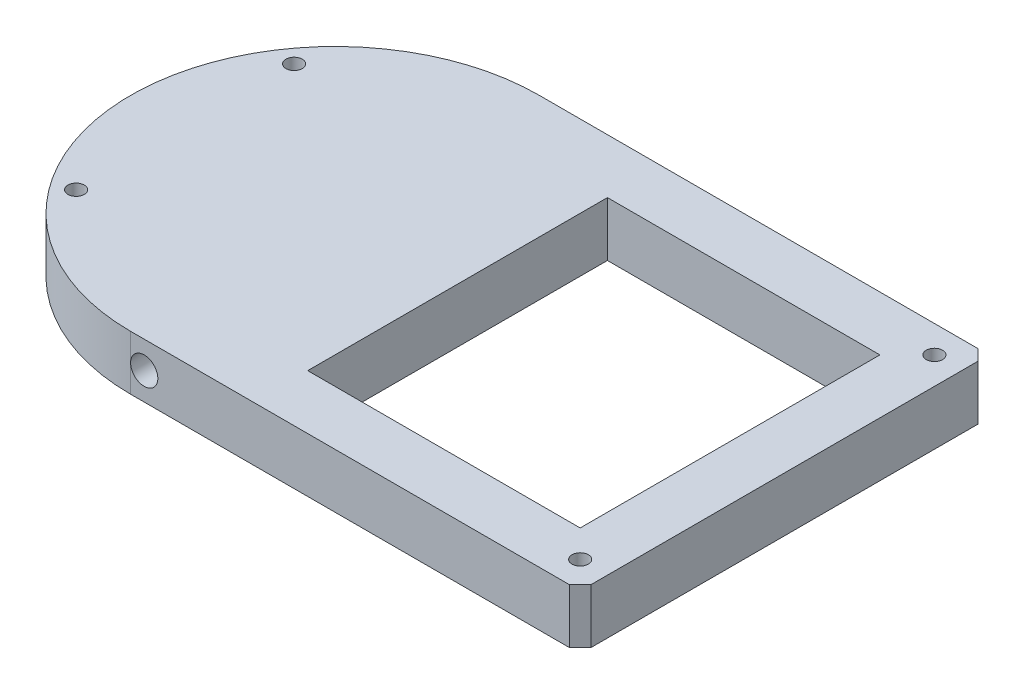
ISO-10303-21;
HEADER;
FILE_DESCRIPTION(('STEP AP214'),'2;1');
FILE_NAME('part.step','',(''),(''),'','','');
FILE_SCHEMA(('AUTOMOTIVE_DESIGN { 1 0 10303 214 1 1 1 1 }'));
ENDSEC;
DATA;
#1=APPLICATION_CONTEXT('core data for automotive mechanical design processes');
#2=APPLICATION_PROTOCOL_DEFINITION('international standard','automotive_design',2000,#1);
#3=PRODUCT_CONTEXT('',#1,'mechanical');
#4=PRODUCT('Part','Part','',(#3));
#5=PRODUCT_RELATED_PRODUCT_CATEGORY('part','',(#4));
#6=PRODUCT_DEFINITION_FORMATION('','',#4);
#7=PRODUCT_DEFINITION_CONTEXT('part definition',#1,'design');
#8=PRODUCT_DEFINITION('design','',#6,#7);
#9=PRODUCT_DEFINITION_SHAPE('','',#8);
#10=(LENGTH_UNIT() NAMED_UNIT(*) SI_UNIT(.MILLI.,.METRE.));
#11=(NAMED_UNIT(*) PLANE_ANGLE_UNIT() SI_UNIT($,.RADIAN.));
#12=(NAMED_UNIT(*) SI_UNIT($,.STERADIAN.) SOLID_ANGLE_UNIT());
#13=UNCERTAINTY_MEASURE_WITH_UNIT(LENGTH_MEASURE(1.E-05),#10,'distance_accuracy_value','');
#14=(GEOMETRIC_REPRESENTATION_CONTEXT(3) GLOBAL_UNCERTAINTY_ASSIGNED_CONTEXT((#13)) GLOBAL_UNIT_ASSIGNED_CONTEXT((#10,
#11,#12)) REPRESENTATION_CONTEXT('',''));
#15=CARTESIAN_POINT('',(0.,0.,0.));
#16=DIRECTION('',(0.,0.,1.));
#17=DIRECTION('',(1.,0.,0.));
#18=AXIS2_PLACEMENT_3D('',#15,#16,#17);
#19=CARTESIAN_POINT('',(0.,10.,0.));
#20=DIRECTION('',(0.,-1.,0.));
#21=DIRECTION('',(0.,0.,-1.));
#22=AXIS2_PLACEMENT_3D('',#19,#20,#21);
#23=CYLINDRICAL_SURFACE('',#22,37.5);
#24=CARTESIAN_POINT('',(0.,0.,0.));
#25=DIRECTION('',(0.,1.,0.));
#26=DIRECTION('',(0.,0.,1.));
#27=AXIS2_PLACEMENT_3D('',#24,#25,#26);
#28=CIRCLE('',#27,37.5);
#29=CARTESIAN_POINT('',(0.,0.,-37.5));
#30=VERTEX_POINT('',#29);
#31=CARTESIAN_POINT('',(0.,0.,37.5));
#32=VERTEX_POINT('',#31);
#33=EDGE_CURVE('E216',#30,#32,#28,.T.);
#34=ORIENTED_EDGE('',*,*,#33,.T.);
#35=DIRECTION('',(0.,-1.,0.));
#36=VECTOR('',#35,1.);
#37=CARTESIAN_POINT('',(0.,10.,37.5));
#38=LINE('',#37,#36);
#39=CARTESIAN_POINT('',(0.,4.99999999999999,37.5));
#40=VERTEX_POINT('',#39);
#41=EDGE_CURVE('E250',#40,#32,#38,.T.);
#42=ORIENTED_EDGE('',*,*,#41,.F.);
#43=CARTESIAN_POINT('',(0.,10.,37.5));
#44=VERTEX_POINT('',#43);
#45=EDGE_CURVE('E251',#44,#40,#38,.T.);
#46=ORIENTED_EDGE('',*,*,#45,.F.);
#47=CARTESIAN_POINT('',(0.,10.,0.));
#48=DIRECTION('',(0.,1.,0.));
#49=DIRECTION('',(0.,0.,1.));
#50=AXIS2_PLACEMENT_3D('',#47,#48,#49);
#51=CIRCLE('',#50,37.5);
#52=CARTESIAN_POINT('',(0.,10.,-37.5));
#53=VERTEX_POINT('',#52);
#54=EDGE_CURVE('E219',#53,#44,#51,.T.);
#55=ORIENTED_EDGE('',*,*,#54,.F.);
#56=DIRECTION('',(0.,-1.,0.));
#57=VECTOR('',#56,1.);
#58=CARTESIAN_POINT('',(0.,10.,-37.5));
#59=LINE('',#58,#57);
#60=CARTESIAN_POINT('',(0.,4.99999999999999,-37.5));
#61=VERTEX_POINT('',#60);
#62=EDGE_CURVE('E246',#53,#61,#59,.T.);
#63=ORIENTED_EDGE('',*,*,#62,.T.);
#64=EDGE_CURVE('E233',#61,#30,#59,.T.);
#65=ORIENTED_EDGE('',*,*,#64,.T.);
#66=EDGE_LOOP('',(#34,#42,#46,#55,#63,#65));
#67=FACE_BOUND('',#66,.T.);
#68=ADVANCED_FACE('F38',(#67),#23,.T.);
#69=CARTESIAN_POINT('',(82.5,10.,37.5));
#70=DIRECTION('',(0.,0.,-1.));
#71=DIRECTION('',(-1.,0.,0.));
#72=AXIS2_PLACEMENT_3D('',#69,#70,#71);
#73=PLANE('',#72);
#74=DIRECTION('',(1.,0.,0.));
#75=VECTOR('',#74,1.);
#76=CARTESIAN_POINT('',(82.5,0.,37.5));
#77=LINE('',#76,#75);
#78=CARTESIAN_POINT('',(80.5,0.,37.5));
#79=VERTEX_POINT('',#78);
#80=EDGE_CURVE('E237',#32,#79,#77,.T.);
#81=ORIENTED_EDGE('',*,*,#80,.T.);
#82=DIRECTION('',(0.,1.,0.));
#83=VECTOR('',#82,1.);
#84=CARTESIAN_POINT('',(80.5,10.,37.5));
#85=LINE('',#84,#83);
#86=CARTESIAN_POINT('',(80.5,10.,37.5));
#87=VERTEX_POINT('',#86);
#88=EDGE_CURVE('E62',#79,#87,#85,.T.);
#89=ORIENTED_EDGE('',*,*,#88,.T.);
#90=DIRECTION('',(1.,0.,0.));
#91=VECTOR('',#90,1.);
#92=CARTESIAN_POINT('',(82.5,10.,37.5));
#93=LINE('',#92,#91);
#94=EDGE_CURVE('E223',#44,#87,#93,.T.);
#95=ORIENTED_EDGE('',*,*,#94,.F.);
#96=ORIENTED_EDGE('',*,*,#45,.T.);
#97=CARTESIAN_POINT('',(2.50000000000001,4.99999999999999,37.5));
#98=DIRECTION('',(0.,0.,1.));
#99=DIRECTION('',(1.,0.,0.));
#100=AXIS2_PLACEMENT_3D('',#97,#98,#99);
#101=CIRCLE('',#100,2.5);
#102=EDGE_CURVE('E208',#40,#40,#101,.T.);
#103=ORIENTED_EDGE('',*,*,#102,.F.);
#104=ORIENTED_EDGE('',*,*,#41,.T.);
#105=EDGE_LOOP('',(#81,#89,#95,#96,#103,#104));
#106=FACE_BOUND('',#105,.T.);
#107=ADVANCED_FACE('F285',(#106),#73,.F.);
#108=CARTESIAN_POINT('',(82.5,10.,-37.5));
#109=DIRECTION('',(-1.,0.,0.));
#110=DIRECTION('',(0.,0.,1.));
#111=AXIS2_PLACEMENT_3D('',#108,#109,#110);
#112=PLANE('',#111);
#113=DIRECTION('',(0.,0.,-1.));
#114=VECTOR('',#113,1.);
#115=CARTESIAN_POINT('',(82.5,10.,-37.5));
#116=LINE('',#115,#114);
#117=CARTESIAN_POINT('',(82.5,10.,35.5));
#118=VERTEX_POINT('',#117);
#119=CARTESIAN_POINT('',(82.5,10.,-35.5));
#120=VERTEX_POINT('',#119);
#121=EDGE_CURVE('E227',#118,#120,#116,.T.);
#122=ORIENTED_EDGE('',*,*,#121,.F.);
#123=DIRECTION('',(0.,-1.,0.));
#124=VECTOR('',#123,1.);
#125=CARTESIAN_POINT('',(82.5,10.,35.5));
#126=LINE('',#125,#124);
#127=CARTESIAN_POINT('',(82.5,0.,35.5));
#128=VERTEX_POINT('',#127);
#129=EDGE_CURVE('E258',#118,#128,#126,.T.);
#130=ORIENTED_EDGE('',*,*,#129,.T.);
#131=DIRECTION('',(0.,0.,-1.));
#132=VECTOR('',#131,1.);
#133=CARTESIAN_POINT('',(82.5,0.,-37.5));
#134=LINE('',#133,#132);
#135=CARTESIAN_POINT('',(82.5,0.,-35.5));
#136=VERTEX_POINT('',#135);
#137=EDGE_CURVE('E240',#128,#136,#134,.T.);
#138=ORIENTED_EDGE('',*,*,#137,.T.);
#139=DIRECTION('',(0.,1.,0.));
#140=VECTOR('',#139,1.);
#141=CARTESIAN_POINT('',(82.5,10.,-35.5));
#142=LINE('',#141,#140);
#143=EDGE_CURVE('E255',#136,#120,#142,.T.);
#144=ORIENTED_EDGE('',*,*,#143,.T.);
#145=EDGE_LOOP('',(#122,#130,#138,#144));
#146=FACE_BOUND('',#145,.T.);
#147=ADVANCED_FACE('F278',(#146),#112,.F.);
#148=CARTESIAN_POINT('',(0.,10.,-37.5));
#149=DIRECTION('',(0.,0.,1.));
#150=DIRECTION('',(1.,0.,0.));
#151=AXIS2_PLACEMENT_3D('',#148,#149,#150);
#152=PLANE('',#151);
#153=DIRECTION('',(-1.,0.,0.));
#154=VECTOR('',#153,1.);
#155=CARTESIAN_POINT('',(0.,10.,-37.5));
#156=LINE('',#155,#154);
#157=CARTESIAN_POINT('',(80.5,10.,-37.5));
#158=VERTEX_POINT('',#157);
#159=EDGE_CURVE('E230',#158,#53,#156,.T.);
#160=ORIENTED_EDGE('',*,*,#159,.F.);
#161=DIRECTION('',(0.,-1.,0.));
#162=VECTOR('',#161,1.);
#163=CARTESIAN_POINT('',(80.5,10.,-37.5));
#164=LINE('',#163,#162);
#165=CARTESIAN_POINT('',(80.5,0.,-37.5));
#166=VERTEX_POINT('',#165);
#167=EDGE_CURVE('E11',#158,#166,#164,.T.);
#168=ORIENTED_EDGE('',*,*,#167,.T.);
#169=DIRECTION('',(-1.,0.,0.));
#170=VECTOR('',#169,1.);
#171=CARTESIAN_POINT('',(0.,0.,-37.5));
#172=LINE('',#171,#170);
#173=EDGE_CURVE('E224',#166,#30,#172,.T.);
#174=ORIENTED_EDGE('',*,*,#173,.T.);
#175=ORIENTED_EDGE('',*,*,#64,.F.);
#176=CARTESIAN_POINT('',(2.50000000000001,4.99999999999999,-37.5));
#177=DIRECTION('',(0.,0.,1.));
#178=DIRECTION('',(1.,0.,0.));
#179=AXIS2_PLACEMENT_3D('',#176,#177,#178);
#180=CIRCLE('',#179,2.5);
#181=EDGE_CURVE('E212',#61,#61,#180,.T.);
#182=ORIENTED_EDGE('',*,*,#181,.T.);
#183=ORIENTED_EDGE('',*,*,#62,.F.);
#184=EDGE_LOOP('',(#160,#168,#174,#175,#182,#183));
#185=FACE_BOUND('',#184,.T.);
#186=ADVANCED_FACE('F298',(#185),#152,.F.);
#187=CARTESIAN_POINT('',(0.,10.,0.));
#188=DIRECTION('',(0.,1.,0.));
#189=DIRECTION('',(0.,0.,1.));
#190=AXIS2_PLACEMENT_3D('',#187,#188,#189);
#191=PLANE('',#190);
#192=DIRECTION('',(0.,0.,1.));
#193=VECTOR('',#192,1.);
#194=CARTESIAN_POINT('',(22.5,10.,27.5));
#195=LINE('',#194,#193);
#196=CARTESIAN_POINT('',(22.5,10.,-27.5));
#197=VERTEX_POINT('',#196);
#198=CARTESIAN_POINT('',(22.5,10.,27.5));
#199=VERTEX_POINT('',#198);
#200=EDGE_CURVE('E131',#197,#199,#195,.T.);
#201=ORIENTED_EDGE('',*,*,#200,.F.);
#202=DIRECTION('',(-1.,0.,0.));
#203=VECTOR('',#202,1.);
#204=CARTESIAN_POINT('',(72.5,10.,-27.5));
#205=LINE('',#204,#203);
#206=CARTESIAN_POINT('',(72.5,10.,-27.5));
#207=VERTEX_POINT('',#206);
#208=EDGE_CURVE('E152',#207,#197,#205,.T.);
#209=ORIENTED_EDGE('',*,*,#208,.F.);
#210=DIRECTION('',(0.,0.,-1.));
#211=VECTOR('',#210,1.);
#212=CARTESIAN_POINT('',(72.5,10.,27.5));
#213=LINE('',#212,#211);
#214=CARTESIAN_POINT('',(72.5,10.,27.5));
#215=VERTEX_POINT('',#214);
#216=EDGE_CURVE('E156',#215,#207,#213,.T.);
#217=ORIENTED_EDGE('',*,*,#216,.F.);
#218=DIRECTION('',(1.,0.,0.));
#219=VECTOR('',#218,1.);
#220=CARTESIAN_POINT('',(72.5,10.,27.5));
#221=LINE('',#220,#219);
#222=EDGE_CURVE('E165',#199,#215,#221,.T.);
#223=ORIENTED_EDGE('',*,*,#222,.F.);
#224=EDGE_LOOP('',(#201,#209,#217,#223));
#225=FACE_BOUND('',#224,.T.);
#226=CARTESIAN_POINT('',(77.5,10.,32.5));
#227=DIRECTION('',(0.,1.,0.));
#228=DIRECTION('',(0.,0.,1.));
#229=AXIS2_PLACEMENT_3D('',#226,#227,#228);
#230=CIRCLE('',#229,1.5);
#231=CARTESIAN_POINT('',(77.5,10.,34.));
#232=VERTEX_POINT('',#231);
#233=EDGE_CURVE('E174',#232,#232,#230,.T.);
#234=ORIENTED_EDGE('',*,*,#233,.F.);
#235=EDGE_LOOP('',(#234));
#236=FACE_BOUND('',#235,.T.);
#237=CARTESIAN_POINT('',(77.5,10.,-32.5));
#238=DIRECTION('',(0.,1.,0.));
#239=DIRECTION('',(0.,0.,1.));
#240=AXIS2_PLACEMENT_3D('',#237,#238,#239);
#241=CIRCLE('',#240,1.5);
#242=CARTESIAN_POINT('',(77.5,10.,-31.));
#243=VERTEX_POINT('',#242);
#244=EDGE_CURVE('E193',#243,#243,#241,.T.);
#245=ORIENTED_EDGE('',*,*,#244,.F.);
#246=EDGE_LOOP('',(#245));
#247=FACE_BOUND('',#246,.T.);
#248=CARTESIAN_POINT('',(-27.5,10.,20.));
#249=DIRECTION('',(0.,1.,0.));
#250=DIRECTION('',(0.,0.,1.));
#251=AXIS2_PLACEMENT_3D('',#248,#249,#250);
#252=CIRCLE('',#251,1.5);
#253=CARTESIAN_POINT('',(-27.5,10.,21.5));
#254=VERTEX_POINT('',#253);
#255=EDGE_CURVE('E185',#254,#254,#252,.T.);
#256=ORIENTED_EDGE('',*,*,#255,.F.);
#257=EDGE_LOOP('',(#256));
#258=FACE_BOUND('',#257,.T.);
#259=CARTESIAN_POINT('',(-27.5,10.,-20.));
#260=DIRECTION('',(0.,1.,0.));
#261=DIRECTION('',(0.,0.,1.));
#262=AXIS2_PLACEMENT_3D('',#259,#260,#261);
#263=CIRCLE('',#262,1.5);
#264=CARTESIAN_POINT('',(-27.5,10.,-18.5));
#265=VERTEX_POINT('',#264);
#266=EDGE_CURVE('E184',#265,#265,#263,.T.);
#267=ORIENTED_EDGE('',*,*,#266,.F.);
#268=EDGE_LOOP('',(#267));
#269=FACE_BOUND('',#268,.T.);
#270=ORIENTED_EDGE('',*,*,#94,.T.);
#271=DIRECTION('',(-0.70710678118655,0.,0.707106781186545));
#272=VECTOR('',#271,1.);
#273=CARTESIAN_POINT('',(58.9999999999997,10.,59.0000000000001));
#274=LINE('',#273,#272);
#275=EDGE_CURVE('E47',#87,#118,#274,.F.);
#276=ORIENTED_EDGE('',*,*,#275,.T.);
#277=ORIENTED_EDGE('',*,*,#121,.T.);
#278=DIRECTION('',(0.707106781186543,0.,0.707106781186552));
#279=VECTOR('',#278,1.);
#280=CARTESIAN_POINT('',(59.0000000000006,10.,-58.9999999999997));
#281=LINE('',#280,#279);
#282=EDGE_CURVE('E54',#120,#158,#281,.F.);
#283=ORIENTED_EDGE('',*,*,#282,.T.);
#284=ORIENTED_EDGE('',*,*,#159,.T.);
#285=ORIENTED_EDGE('',*,*,#54,.T.);
#286=EDGE_LOOP('',(#270,#276,#277,#283,#284,#285));
#287=FACE_BOUND('',#286,.T.);
#288=ADVANCED_FACE('F274',(#225,#236,#247,#258,#269,#287),#191,.T.);
#289=CARTESIAN_POINT('',(0.,0.,0.));
#290=DIRECTION('',(0.,1.,0.));
#291=DIRECTION('',(0.,0.,1.));
#292=AXIS2_PLACEMENT_3D('',#289,#290,#291);
#293=PLANE('',#292);
#294=DIRECTION('',(-1.,0.,0.));
#295=VECTOR('',#294,1.);
#296=CARTESIAN_POINT('',(72.5,0.,-27.5));
#297=LINE('',#296,#295);
#298=CARTESIAN_POINT('',(72.5,0.,-27.5));
#299=VERTEX_POINT('',#298);
#300=CARTESIAN_POINT('',(22.5,0.,-27.5));
#301=VERTEX_POINT('',#300);
#302=EDGE_CURVE('E137',#299,#301,#297,.T.);
#303=ORIENTED_EDGE('',*,*,#302,.T.);
#304=DIRECTION('',(0.,0.,1.));
#305=VECTOR('',#304,1.);
#306=CARTESIAN_POINT('',(22.5,0.,27.5));
#307=LINE('',#306,#305);
#308=CARTESIAN_POINT('',(22.5,0.,27.5));
#309=VERTEX_POINT('',#308);
#310=EDGE_CURVE('E128',#301,#309,#307,.T.);
#311=ORIENTED_EDGE('',*,*,#310,.T.);
#312=DIRECTION('',(1.,0.,0.));
#313=VECTOR('',#312,1.);
#314=CARTESIAN_POINT('',(72.5,0.,27.5));
#315=LINE('',#314,#313);
#316=CARTESIAN_POINT('',(72.5,0.,27.5));
#317=VERTEX_POINT('',#316);
#318=EDGE_CURVE('E141',#309,#317,#315,.T.);
#319=ORIENTED_EDGE('',*,*,#318,.T.);
#320=DIRECTION('',(0.,0.,-1.));
#321=VECTOR('',#320,1.);
#322=CARTESIAN_POINT('',(72.5,0.,27.5));
#323=LINE('',#322,#321);
#324=EDGE_CURVE('E146',#317,#299,#323,.T.);
#325=ORIENTED_EDGE('',*,*,#324,.T.);
#326=EDGE_LOOP('',(#303,#311,#319,#325));
#327=FACE_BOUND('',#326,.T.);
#328=CARTESIAN_POINT('',(77.5,0.,32.5));
#329=DIRECTION('',(0.,1.,0.));
#330=DIRECTION('',(0.,0.,1.));
#331=AXIS2_PLACEMENT_3D('',#328,#329,#330);
#332=CIRCLE('',#331,1.5);
#333=CARTESIAN_POINT('',(77.5,0.,34.));
#334=VERTEX_POINT('',#333);
#335=EDGE_CURVE('E197',#334,#334,#332,.T.);
#336=ORIENTED_EDGE('',*,*,#335,.T.);
#337=EDGE_LOOP('',(#336));
#338=FACE_BOUND('',#337,.T.);
#339=CARTESIAN_POINT('',(77.5,0.,-32.5));
#340=DIRECTION('',(0.,1.,0.));
#341=DIRECTION('',(0.,0.,1.));
#342=AXIS2_PLACEMENT_3D('',#339,#340,#341);
#343=CIRCLE('',#342,1.5);
#344=CARTESIAN_POINT('',(77.5,0.,-31.));
#345=VERTEX_POINT('',#344);
#346=EDGE_CURVE('E189',#345,#345,#343,.T.);
#347=ORIENTED_EDGE('',*,*,#346,.T.);
#348=EDGE_LOOP('',(#347));
#349=FACE_BOUND('',#348,.T.);
#350=CARTESIAN_POINT('',(-27.5,0.,20.));
#351=DIRECTION('',(0.,1.,0.));
#352=DIRECTION('',(0.,0.,1.));
#353=AXIS2_PLACEMENT_3D('',#350,#351,#352);
#354=CIRCLE('',#353,1.5);
#355=CARTESIAN_POINT('',(-27.5,0.,21.5));
#356=VERTEX_POINT('',#355);
#357=EDGE_CURVE('E180',#356,#356,#354,.T.);
#358=ORIENTED_EDGE('',*,*,#357,.T.);
#359=EDGE_LOOP('',(#358));
#360=FACE_BOUND('',#359,.T.);
#361=CARTESIAN_POINT('',(-27.5,0.,-20.));
#362=DIRECTION('',(0.,1.,0.));
#363=DIRECTION('',(0.,0.,1.));
#364=AXIS2_PLACEMENT_3D('',#361,#362,#363);
#365=CIRCLE('',#364,1.5);
#366=CARTESIAN_POINT('',(-27.5,0.,-18.5));
#367=VERTEX_POINT('',#366);
#368=EDGE_CURVE('E204',#367,#367,#365,.T.);
#369=ORIENTED_EDGE('',*,*,#368,.T.);
#370=EDGE_LOOP('',(#369));
#371=FACE_BOUND('',#370,.T.);
#372=ORIENTED_EDGE('',*,*,#137,.F.);
#373=DIRECTION('',(0.70710678118655,0.,-0.707106781186545));
#374=VECTOR('',#373,1.);
#375=CARTESIAN_POINT('',(82.5,0.,35.5));
#376=LINE('',#375,#374);
#377=EDGE_CURVE('E265',#128,#79,#376,.F.);
#378=ORIENTED_EDGE('',*,*,#377,.T.);
#379=ORIENTED_EDGE('',*,*,#80,.F.);
#380=ORIENTED_EDGE('',*,*,#33,.F.);
#381=ORIENTED_EDGE('',*,*,#173,.F.);
#382=DIRECTION('',(-0.707106781186543,0.,-0.707106781186552));
#383=VECTOR('',#382,1.);
#384=CARTESIAN_POINT('',(80.5,0.,-37.5));
#385=LINE('',#384,#383);
#386=EDGE_CURVE('E262',#166,#136,#385,.F.);
#387=ORIENTED_EDGE('',*,*,#386,.T.);
#388=EDGE_LOOP('',(#372,#378,#379,#380,#381,#387));
#389=FACE_BOUND('',#388,.T.);
#390=ADVANCED_FACE('F148',(#327,#338,#349,#360,#371,#389),#293,.F.);
#391=CARTESIAN_POINT('',(2.50000000000001,4.99999999999999,-37.5));
#392=DIRECTION('',(0.,0.,1.));
#393=DIRECTION('',(1.,0.,0.));
#394=AXIS2_PLACEMENT_3D('',#391,#392,#393);
#395=CYLINDRICAL_SURFACE('',#394,2.5);
#396=ORIENTED_EDGE('',*,*,#181,.F.);
#397=EDGE_LOOP('',(#396));
#398=FACE_BOUND('',#397,.T.);
#399=ORIENTED_EDGE('',*,*,#102,.T.);
#400=EDGE_LOOP('',(#399));
#401=FACE_BOUND('',#400,.T.);
#402=ADVANCED_FACE('F319',(#398,#401),#395,.F.);
#403=CARTESIAN_POINT('',(-27.5,0.,-20.));
#404=DIRECTION('',(0.,1.,0.));
#405=DIRECTION('',(0.,0.,1.));
#406=AXIS2_PLACEMENT_3D('',#403,#404,#405);
#407=CYLINDRICAL_SURFACE('',#406,1.5);
#408=ORIENTED_EDGE('',*,*,#368,.F.);
#409=EDGE_LOOP('',(#408));
#410=FACE_BOUND('',#409,.T.);
#411=ORIENTED_EDGE('',*,*,#266,.T.);
#412=EDGE_LOOP('',(#411));
#413=FACE_BOUND('',#412,.T.);
#414=ADVANCED_FACE('F325',(#410,#413),#407,.F.);
#415=CARTESIAN_POINT('',(-27.5,0.,20.));
#416=DIRECTION('',(0.,1.,0.));
#417=DIRECTION('',(0.,0.,1.));
#418=AXIS2_PLACEMENT_3D('',#415,#416,#417);
#419=CYLINDRICAL_SURFACE('',#418,1.5);
#420=ORIENTED_EDGE('',*,*,#357,.F.);
#421=EDGE_LOOP('',(#420));
#422=FACE_BOUND('',#421,.T.);
#423=ORIENTED_EDGE('',*,*,#255,.T.);
#424=EDGE_LOOP('',(#423));
#425=FACE_BOUND('',#424,.T.);
#426=ADVANCED_FACE('F329',(#422,#425),#419,.F.);
#427=CARTESIAN_POINT('',(77.5,0.,-32.5));
#428=DIRECTION('',(0.,1.,0.));
#429=DIRECTION('',(0.,0.,1.));
#430=AXIS2_PLACEMENT_3D('',#427,#428,#429);
#431=CYLINDRICAL_SURFACE('',#430,1.5);
#432=ORIENTED_EDGE('',*,*,#346,.F.);
#433=EDGE_LOOP('',(#432));
#434=FACE_BOUND('',#433,.T.);
#435=ORIENTED_EDGE('',*,*,#244,.T.);
#436=EDGE_LOOP('',(#435));
#437=FACE_BOUND('',#436,.T.);
#438=ADVANCED_FACE('F334',(#434,#437),#431,.F.);
#439=CARTESIAN_POINT('',(77.5,0.,32.5));
#440=DIRECTION('',(0.,1.,0.));
#441=DIRECTION('',(0.,0.,1.));
#442=AXIS2_PLACEMENT_3D('',#439,#440,#441);
#443=CYLINDRICAL_SURFACE('',#442,1.5);
#444=ORIENTED_EDGE('',*,*,#335,.F.);
#445=EDGE_LOOP('',(#444));
#446=FACE_BOUND('',#445,.T.);
#447=ORIENTED_EDGE('',*,*,#233,.T.);
#448=EDGE_LOOP('',(#447));
#449=FACE_BOUND('',#448,.T.);
#450=ADVANCED_FACE('F331',(#446,#449),#443,.F.);
#451=CARTESIAN_POINT('',(22.5,0.,27.5));
#452=DIRECTION('',(-1.,0.,0.));
#453=DIRECTION('',(0.,0.,1.));
#454=AXIS2_PLACEMENT_3D('',#451,#452,#453);
#455=PLANE('',#454);
#456=ORIENTED_EDGE('',*,*,#200,.T.);
#457=DIRECTION('',(0.,1.,0.));
#458=VECTOR('',#457,1.);
#459=CARTESIAN_POINT('',(22.5,0.,27.5));
#460=LINE('',#459,#458);
#461=EDGE_CURVE('E124',#309,#199,#460,.T.);
#462=ORIENTED_EDGE('',*,*,#461,.F.);
#463=ORIENTED_EDGE('',*,*,#310,.F.);
#464=DIRECTION('',(0.,1.,0.));
#465=VECTOR('',#464,1.);
#466=CARTESIAN_POINT('',(22.5,0.,-27.5));
#467=LINE('',#466,#465);
#468=EDGE_CURVE('E171',#301,#197,#467,.T.);
#469=ORIENTED_EDGE('',*,*,#468,.T.);
#470=EDGE_LOOP('',(#456,#462,#463,#469));
#471=FACE_BOUND('',#470,.T.);
#472=ADVANCED_FACE('F126',(#471),#455,.F.);
#473=CARTESIAN_POINT('',(72.5,0.,-27.5));
#474=DIRECTION('',(0.,0.,-1.));
#475=DIRECTION('',(-1.,0.,0.));
#476=AXIS2_PLACEMENT_3D('',#473,#474,#475);
#477=PLANE('',#476);
#478=ORIENTED_EDGE('',*,*,#208,.T.);
#479=ORIENTED_EDGE('',*,*,#468,.F.);
#480=ORIENTED_EDGE('',*,*,#302,.F.);
#481=DIRECTION('',(0.,1.,0.));
#482=VECTOR('',#481,1.);
#483=CARTESIAN_POINT('',(72.5,0.,-27.5));
#484=LINE('',#483,#482);
#485=EDGE_CURVE('E175',#299,#207,#484,.T.);
#486=ORIENTED_EDGE('',*,*,#485,.T.);
#487=EDGE_LOOP('',(#478,#479,#480,#486));
#488=FACE_BOUND('',#487,.T.);
#489=ADVANCED_FACE('F344',(#488),#477,.F.);
#490=CARTESIAN_POINT('',(72.5,0.,27.5));
#491=DIRECTION('',(1.,0.,0.));
#492=DIRECTION('',(0.,0.,-1.));
#493=AXIS2_PLACEMENT_3D('',#490,#491,#492);
#494=PLANE('',#493);
#495=ORIENTED_EDGE('',*,*,#216,.T.);
#496=ORIENTED_EDGE('',*,*,#485,.F.);
#497=ORIENTED_EDGE('',*,*,#324,.F.);
#498=DIRECTION('',(0.,1.,0.));
#499=VECTOR('',#498,1.);
#500=CARTESIAN_POINT('',(72.5,0.,27.5));
#501=LINE('',#500,#499);
#502=EDGE_CURVE('E136',#317,#215,#501,.T.);
#503=ORIENTED_EDGE('',*,*,#502,.T.);
#504=EDGE_LOOP('',(#495,#496,#497,#503));
#505=FACE_BOUND('',#504,.T.);
#506=ADVANCED_FACE('F347',(#505),#494,.F.);
#507=CARTESIAN_POINT('',(72.5,0.,27.5));
#508=DIRECTION('',(0.,0.,1.));
#509=DIRECTION('',(1.,0.,0.));
#510=AXIS2_PLACEMENT_3D('',#507,#508,#509);
#511=PLANE('',#510);
#512=ORIENTED_EDGE('',*,*,#222,.T.);
#513=ORIENTED_EDGE('',*,*,#502,.F.);
#514=ORIENTED_EDGE('',*,*,#318,.F.);
#515=ORIENTED_EDGE('',*,*,#461,.T.);
#516=EDGE_LOOP('',(#512,#513,#514,#515));
#517=FACE_BOUND('',#516,.T.);
#518=ADVANCED_FACE('F142',(#517),#511,.F.);
#519=CARTESIAN_POINT('',(82.5,10.,35.5));
#520=DIRECTION('',(-0.707106781186545,0.,-0.70710678118655));
#521=DIRECTION('',(0.,-1.,0.));
#522=AXIS2_PLACEMENT_3D('',#519,#520,#521);
#523=PLANE('',#522);
#524=ORIENTED_EDGE('',*,*,#275,.F.);
#525=ORIENTED_EDGE('',*,*,#88,.F.);
#526=ORIENTED_EDGE('',*,*,#377,.F.);
#527=ORIENTED_EDGE('',*,*,#129,.F.);
#528=EDGE_LOOP('',(#524,#525,#526,#527));
#529=FACE_BOUND('',#528,.T.);
#530=ADVANCED_FACE('F281',(#529),#523,.F.);
#531=CARTESIAN_POINT('',(80.5,10.,-37.5));
#532=DIRECTION('',(-0.707106781186552,0.,0.707106781186542));
#533=DIRECTION('',(0.,-1.,0.));
#534=AXIS2_PLACEMENT_3D('',#531,#532,#533);
#535=PLANE('',#534);
#536=ORIENTED_EDGE('',*,*,#282,.F.);
#537=ORIENTED_EDGE('',*,*,#143,.F.);
#538=ORIENTED_EDGE('',*,*,#386,.F.);
#539=ORIENTED_EDGE('',*,*,#167,.F.);
#540=EDGE_LOOP('',(#536,#537,#538,#539));
#541=FACE_BOUND('',#540,.T.);
#542=ADVANCED_FACE('F40',(#541),#535,.F.);
#543=CLOSED_SHELL('',(#68,#107,#147,#186,#288,#390,#402,#414,#426,#438,#450,#472,#489,#506,#518,
#530,#542));
#544=MANIFOLD_SOLID_BREP('B2',#543);
#545=ADVANCED_BREP_SHAPE_REPRESENTATION('',(#18,#544),#14);
#546=SHAPE_DEFINITION_REPRESENTATION(#9,#545);
ENDSEC;
END-ISO-10303-21;
